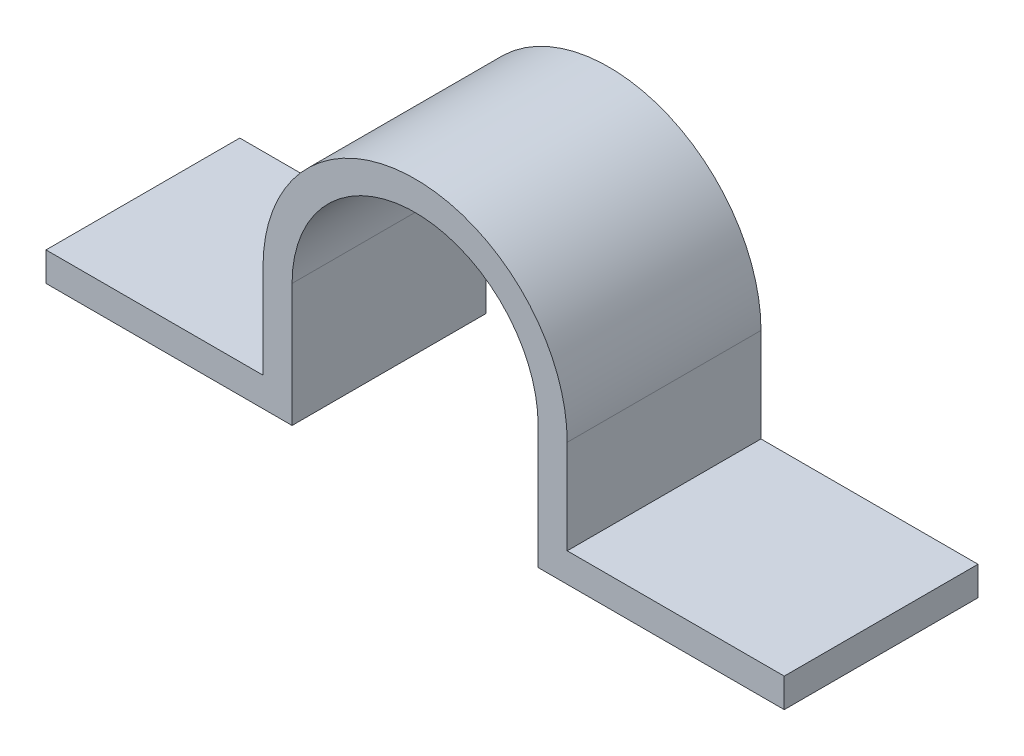
ISO-10303-21;
HEADER;
FILE_DESCRIPTION(('STEP AP214'),'2;1');
FILE_NAME('part.step','',(''),(''),'','','');
FILE_SCHEMA(('AUTOMOTIVE_DESIGN { 1 0 10303 214 1 1 1 1 }'));
ENDSEC;
DATA;
#1=APPLICATION_CONTEXT('core data for automotive mechanical design processes');
#2=APPLICATION_PROTOCOL_DEFINITION('international standard','automotive_design',2000,#1);
#3=PRODUCT_CONTEXT('',#1,'mechanical');
#4=PRODUCT('Part','Part','',(#3));
#5=PRODUCT_RELATED_PRODUCT_CATEGORY('part','',(#4));
#6=PRODUCT_DEFINITION_FORMATION('','',#4);
#7=PRODUCT_DEFINITION_CONTEXT('part definition',#1,'design');
#8=PRODUCT_DEFINITION('design','',#6,#7);
#9=PRODUCT_DEFINITION_SHAPE('','',#8);
#10=(LENGTH_UNIT() NAMED_UNIT(*) SI_UNIT(.MILLI.,.METRE.));
#11=(NAMED_UNIT(*) PLANE_ANGLE_UNIT() SI_UNIT($,.RADIAN.));
#12=(NAMED_UNIT(*) SI_UNIT($,.STERADIAN.) SOLID_ANGLE_UNIT());
#13=UNCERTAINTY_MEASURE_WITH_UNIT(LENGTH_MEASURE(1.E-05),#10,'distance_accuracy_value','');
#14=(GEOMETRIC_REPRESENTATION_CONTEXT(3) GLOBAL_UNCERTAINTY_ASSIGNED_CONTEXT((#13)) GLOBAL_UNIT_ASSIGNED_CONTEXT((#10,
#11,#12)) REPRESENTATION_CONTEXT('',''));
#15=CARTESIAN_POINT('',(0.,0.,0.));
#16=DIRECTION('',(0.,0.,1.));
#17=DIRECTION('',(1.,0.,0.));
#18=AXIS2_PLACEMENT_3D('',#15,#16,#17);
#19=CARTESIAN_POINT('',(-38.1,3.,20.));
#20=DIRECTION('',(0.,-1.,0.));
#21=DIRECTION('',(1.,0.,0.));
#22=AXIS2_PLACEMENT_3D('',#19,#20,#21);
#23=PLANE('',#22);
#24=DIRECTION('',(-1.,0.,0.));
#25=VECTOR('',#24,1.);
#26=CARTESIAN_POINT('',(-38.1,3.,0.));
#27=LINE('',#26,#25);
#28=CARTESIAN_POINT('',(-15.7,3.,0.));
#29=VERTEX_POINT('',#28);
#30=CARTESIAN_POINT('',(-38.1,3.,0.));
#31=VERTEX_POINT('',#30);
#32=EDGE_CURVE('E153',#29,#31,#27,.T.);
#33=ORIENTED_EDGE('',*,*,#32,.T.);
#34=DIRECTION('',(0.,0.,-1.));
#35=VECTOR('',#34,1.);
#36=CARTESIAN_POINT('',(-38.1,3.,20.));
#37=LINE('',#36,#35);
#38=CARTESIAN_POINT('',(-38.1,3.,20.));
#39=VERTEX_POINT('',#38);
#40=EDGE_CURVE('E11',#39,#31,#37,.T.);
#41=ORIENTED_EDGE('',*,*,#40,.F.);
#42=DIRECTION('',(-1.,0.,0.));
#43=VECTOR('',#42,1.);
#44=CARTESIAN_POINT('',(-38.1,3.,20.));
#45=LINE('',#44,#43);
#46=CARTESIAN_POINT('',(-15.7,3.,20.));
#47=VERTEX_POINT('',#46);
#48=EDGE_CURVE('E101',#47,#39,#45,.T.);
#49=ORIENTED_EDGE('',*,*,#48,.F.);
#50=DIRECTION('',(0.,0.,-1.));
#51=VECTOR('',#50,1.);
#52=CARTESIAN_POINT('',(-15.7,3.,20.));
#53=LINE('',#52,#51);
#54=EDGE_CURVE('E149',#47,#29,#53,.T.);
#55=ORIENTED_EDGE('',*,*,#54,.T.);
#56=EDGE_LOOP('',(#33,#41,#49,#55));
#57=FACE_BOUND('',#56,.T.);
#58=ADVANCED_FACE('F33',(#57),#23,.F.);
#59=CARTESIAN_POINT('',(-38.1,0.,20.));
#60=DIRECTION('',(-1.,0.,0.));
#61=DIRECTION('',(0.,0.,1.));
#62=AXIS2_PLACEMENT_3D('',#59,#60,#61);
#63=PLANE('',#62);
#64=DIRECTION('',(0.,1.,0.));
#65=VECTOR('',#64,1.);
#66=CARTESIAN_POINT('',(-38.1,0.,0.));
#67=LINE('',#66,#65);
#68=CARTESIAN_POINT('',(-38.1,0.,0.));
#69=VERTEX_POINT('',#68);
#70=EDGE_CURVE('E156',#69,#31,#67,.T.);
#71=ORIENTED_EDGE('',*,*,#70,.F.);
#72=DIRECTION('',(0.,0.,-1.));
#73=VECTOR('',#72,1.);
#74=CARTESIAN_POINT('',(-38.1,0.,20.));
#75=LINE('',#74,#73);
#76=CARTESIAN_POINT('',(-38.1,0.,20.));
#77=VERTEX_POINT('',#76);
#78=EDGE_CURVE('E41',#77,#69,#75,.T.);
#79=ORIENTED_EDGE('',*,*,#78,.F.);
#80=DIRECTION('',(0.,1.,0.));
#81=VECTOR('',#80,1.);
#82=CARTESIAN_POINT('',(-38.1,0.,20.));
#83=LINE('',#82,#81);
#84=EDGE_CURVE('E218',#77,#39,#83,.T.);
#85=ORIENTED_EDGE('',*,*,#84,.T.);
#86=ORIENTED_EDGE('',*,*,#40,.T.);
#87=EDGE_LOOP('',(#71,#79,#85,#86));
#88=FACE_BOUND('',#87,.T.);
#89=ADVANCED_FACE('F205',(#88),#63,.T.);
#90=CARTESIAN_POINT('',(-38.1,0.,20.));
#91=DIRECTION('',(0.,-1.,0.));
#92=DIRECTION('',(1.,0.,0.));
#93=AXIS2_PLACEMENT_3D('',#90,#91,#92);
#94=PLANE('',#93);
#95=DIRECTION('',(-1.,0.,0.));
#96=VECTOR('',#95,1.);
#97=CARTESIAN_POINT('',(-38.1,0.,0.));
#98=LINE('',#97,#96);
#99=CARTESIAN_POINT('',(-12.7,0.,0.));
#100=VERTEX_POINT('',#99);
#101=EDGE_CURVE('E159',#100,#69,#98,.T.);
#102=ORIENTED_EDGE('',*,*,#101,.F.);
#103=DIRECTION('',(0.,0.,-1.));
#104=VECTOR('',#103,1.);
#105=CARTESIAN_POINT('',(-12.7,0.,20.));
#106=LINE('',#105,#104);
#107=CARTESIAN_POINT('',(-12.7,0.,20.));
#108=VERTEX_POINT('',#107);
#109=EDGE_CURVE('E195',#108,#100,#106,.T.);
#110=ORIENTED_EDGE('',*,*,#109,.F.);
#111=DIRECTION('',(-1.,0.,0.));
#112=VECTOR('',#111,1.);
#113=CARTESIAN_POINT('',(-38.1,0.,20.));
#114=LINE('',#113,#112);
#115=EDGE_CURVE('E202',#108,#77,#114,.T.);
#116=ORIENTED_EDGE('',*,*,#115,.T.);
#117=ORIENTED_EDGE('',*,*,#78,.T.);
#118=EDGE_LOOP('',(#102,#110,#116,#117));
#119=FACE_BOUND('',#118,.T.);
#120=ADVANCED_FACE('F200',(#119),#94,.T.);
#121=CARTESIAN_POINT('',(-12.7,0.,20.));
#122=DIRECTION('',(1.,0.,0.));
#123=DIRECTION('',(0.,0.,-1.));
#124=AXIS2_PLACEMENT_3D('',#121,#122,#123);
#125=PLANE('',#124);
#126=DIRECTION('',(0.,-1.,0.));
#127=VECTOR('',#126,1.);
#128=CARTESIAN_POINT('',(-12.7,0.,0.));
#129=LINE('',#128,#127);
#130=CARTESIAN_POINT('',(-12.7,12.7,0.));
#131=VERTEX_POINT('',#130);
#132=EDGE_CURVE('E162',#131,#100,#129,.T.);
#133=ORIENTED_EDGE('',*,*,#132,.F.);
#134=DIRECTION('',(0.,0.,-1.));
#135=VECTOR('',#134,1.);
#136=CARTESIAN_POINT('',(-12.7,12.7,20.));
#137=LINE('',#136,#135);
#138=CARTESIAN_POINT('',(-12.7,12.7,20.));
#139=VERTEX_POINT('',#138);
#140=EDGE_CURVE('E193',#139,#131,#137,.T.);
#141=ORIENTED_EDGE('',*,*,#140,.F.);
#142=DIRECTION('',(0.,-1.,0.));
#143=VECTOR('',#142,1.);
#144=CARTESIAN_POINT('',(-12.7,0.,20.));
#145=LINE('',#144,#143);
#146=EDGE_CURVE('E215',#139,#108,#145,.T.);
#147=ORIENTED_EDGE('',*,*,#146,.T.);
#148=ORIENTED_EDGE('',*,*,#109,.T.);
#149=EDGE_LOOP('',(#133,#141,#147,#148));
#150=FACE_BOUND('',#149,.T.);
#151=ADVANCED_FACE('F212',(#150),#125,.T.);
#152=CARTESIAN_POINT('',(0.,12.7,20.));
#153=DIRECTION('',(0.,0.,-1.));
#154=DIRECTION('',(-1.,0.,0.));
#155=AXIS2_PLACEMENT_3D('',#152,#153,#154);
#156=CYLINDRICAL_SURFACE('',#155,12.7);
#157=CARTESIAN_POINT('',(0.,12.7,0.));
#158=DIRECTION('',(0.,0.,1.));
#159=DIRECTION('',(-1.,0.,0.));
#160=AXIS2_PLACEMENT_3D('',#157,#158,#159);
#161=CIRCLE('',#160,12.7);
#162=CARTESIAN_POINT('',(12.7,12.7,0.));
#163=VERTEX_POINT('',#162);
#164=EDGE_CURVE('E165',#163,#131,#161,.T.);
#165=ORIENTED_EDGE('',*,*,#164,.F.);
#166=DIRECTION('',(0.,0.,-1.));
#167=VECTOR('',#166,1.);
#168=CARTESIAN_POINT('',(12.7,12.7,20.));
#169=LINE('',#168,#167);
#170=CARTESIAN_POINT('',(12.7,12.7,20.));
#171=VERTEX_POINT('',#170);
#172=EDGE_CURVE('E191',#171,#163,#169,.T.);
#173=ORIENTED_EDGE('',*,*,#172,.F.);
#174=CARTESIAN_POINT('',(0.,12.7,20.));
#175=DIRECTION('',(0.,0.,1.));
#176=DIRECTION('',(-1.,0.,0.));
#177=AXIS2_PLACEMENT_3D('',#174,#175,#176);
#178=CIRCLE('',#177,12.7);
#179=EDGE_CURVE('E220',#171,#139,#178,.T.);
#180=ORIENTED_EDGE('',*,*,#179,.T.);
#181=ORIENTED_EDGE('',*,*,#140,.T.);
#182=EDGE_LOOP('',(#165,#173,#180,#181));
#183=FACE_BOUND('',#182,.T.);
#184=ADVANCED_FACE('F320',(#183),#156,.F.);
#185=CARTESIAN_POINT('',(12.7,0.,20.));
#186=DIRECTION('',(-1.,0.,0.));
#187=DIRECTION('',(0.,0.,1.));
#188=AXIS2_PLACEMENT_3D('',#185,#186,#187);
#189=PLANE('',#188);
#190=DIRECTION('',(0.,1.,0.));
#191=VECTOR('',#190,1.);
#192=CARTESIAN_POINT('',(12.7,0.,0.));
#193=LINE('',#192,#191);
#194=CARTESIAN_POINT('',(12.7,0.,0.));
#195=VERTEX_POINT('',#194);
#196=EDGE_CURVE('E168',#195,#163,#193,.T.);
#197=ORIENTED_EDGE('',*,*,#196,.F.);
#198=DIRECTION('',(0.,0.,-1.));
#199=VECTOR('',#198,1.);
#200=CARTESIAN_POINT('',(12.7,0.,20.));
#201=LINE('',#200,#199);
#202=CARTESIAN_POINT('',(12.7,0.,20.));
#203=VERTEX_POINT('',#202);
#204=EDGE_CURVE('E189',#203,#195,#201,.T.);
#205=ORIENTED_EDGE('',*,*,#204,.F.);
#206=DIRECTION('',(0.,1.,0.));
#207=VECTOR('',#206,1.);
#208=CARTESIAN_POINT('',(12.7,0.,20.));
#209=LINE('',#208,#207);
#210=EDGE_CURVE('E226',#203,#171,#209,.T.);
#211=ORIENTED_EDGE('',*,*,#210,.T.);
#212=ORIENTED_EDGE('',*,*,#172,.T.);
#213=EDGE_LOOP('',(#197,#205,#211,#212));
#214=FACE_BOUND('',#213,.T.);
#215=ADVANCED_FACE('F311',(#214),#189,.T.);
#216=CARTESIAN_POINT('',(38.1,0.,20.));
#217=DIRECTION('',(0.,-1.,0.));
#218=DIRECTION('',(1.,0.,0.));
#219=AXIS2_PLACEMENT_3D('',#216,#217,#218);
#220=PLANE('',#219);
#221=DIRECTION('',(-1.,0.,0.));
#222=VECTOR('',#221,1.);
#223=CARTESIAN_POINT('',(38.1,0.,0.));
#224=LINE('',#223,#222);
#225=CARTESIAN_POINT('',(38.1,0.,0.));
#226=VERTEX_POINT('',#225);
#227=EDGE_CURVE('E171',#226,#195,#224,.T.);
#228=ORIENTED_EDGE('',*,*,#227,.F.);
#229=DIRECTION('',(0.,0.,-1.));
#230=VECTOR('',#229,1.);
#231=CARTESIAN_POINT('',(38.1,0.,20.));
#232=LINE('',#231,#230);
#233=CARTESIAN_POINT('',(38.1,0.,20.));
#234=VERTEX_POINT('',#233);
#235=EDGE_CURVE('E187',#234,#226,#232,.T.);
#236=ORIENTED_EDGE('',*,*,#235,.F.);
#237=DIRECTION('',(-1.,0.,0.));
#238=VECTOR('',#237,1.);
#239=CARTESIAN_POINT('',(38.1,0.,20.));
#240=LINE('',#239,#238);
#241=EDGE_CURVE('E229',#234,#203,#240,.T.);
#242=ORIENTED_EDGE('',*,*,#241,.T.);
#243=ORIENTED_EDGE('',*,*,#204,.T.);
#244=EDGE_LOOP('',(#228,#236,#242,#243));
#245=FACE_BOUND('',#244,.T.);
#246=ADVANCED_FACE('F241',(#245),#220,.T.);
#247=CARTESIAN_POINT('',(38.1,3.,20.));
#248=DIRECTION('',(1.,0.,0.));
#249=DIRECTION('',(0.,0.,-1.));
#250=AXIS2_PLACEMENT_3D('',#247,#248,#249);
#251=PLANE('',#250);
#252=DIRECTION('',(0.,-1.,0.));
#253=VECTOR('',#252,1.);
#254=CARTESIAN_POINT('',(38.1,3.,0.));
#255=LINE('',#254,#253);
#256=CARTESIAN_POINT('',(38.1,3.,0.));
#257=VERTEX_POINT('',#256);
#258=EDGE_CURVE('E174',#257,#226,#255,.T.);
#259=ORIENTED_EDGE('',*,*,#258,.F.);
#260=DIRECTION('',(0.,0.,-1.));
#261=VECTOR('',#260,1.);
#262=CARTESIAN_POINT('',(38.1,3.,20.));
#263=LINE('',#262,#261);
#264=CARTESIAN_POINT('',(38.1,3.,20.));
#265=VERTEX_POINT('',#264);
#266=EDGE_CURVE('E185',#265,#257,#263,.T.);
#267=ORIENTED_EDGE('',*,*,#266,.F.);
#268=DIRECTION('',(0.,-1.,0.));
#269=VECTOR('',#268,1.);
#270=CARTESIAN_POINT('',(38.1,3.,20.));
#271=LINE('',#270,#269);
#272=EDGE_CURVE('E232',#265,#234,#271,.T.);
#273=ORIENTED_EDGE('',*,*,#272,.T.);
#274=ORIENTED_EDGE('',*,*,#235,.T.);
#275=EDGE_LOOP('',(#259,#267,#273,#274));
#276=FACE_BOUND('',#275,.T.);
#277=ADVANCED_FACE('F236',(#276),#251,.T.);
#278=CARTESIAN_POINT('',(38.1,3.,20.));
#279=DIRECTION('',(0.,-1.,0.));
#280=DIRECTION('',(1.,0.,0.));
#281=AXIS2_PLACEMENT_3D('',#278,#279,#280);
#282=PLANE('',#281);
#283=DIRECTION('',(-1.,0.,0.));
#284=VECTOR('',#283,1.);
#285=CARTESIAN_POINT('',(38.1,3.,0.));
#286=LINE('',#285,#284);
#287=CARTESIAN_POINT('',(15.7,3.,0.));
#288=VERTEX_POINT('',#287);
#289=EDGE_CURVE('E177',#257,#288,#286,.T.);
#290=ORIENTED_EDGE('',*,*,#289,.T.);
#291=DIRECTION('',(0.,0.,-1.));
#292=VECTOR('',#291,1.);
#293=CARTESIAN_POINT('',(15.7,3.,20.));
#294=LINE('',#293,#292);
#295=CARTESIAN_POINT('',(15.7,3.,20.));
#296=VERTEX_POINT('',#295);
#297=EDGE_CURVE('E144',#296,#288,#294,.T.);
#298=ORIENTED_EDGE('',*,*,#297,.F.);
#299=DIRECTION('',(-1.,0.,0.));
#300=VECTOR('',#299,1.);
#301=CARTESIAN_POINT('',(38.1,3.,20.));
#302=LINE('',#301,#300);
#303=EDGE_CURVE('E135',#265,#296,#302,.T.);
#304=ORIENTED_EDGE('',*,*,#303,.F.);
#305=ORIENTED_EDGE('',*,*,#266,.T.);
#306=EDGE_LOOP('',(#290,#298,#304,#305));
#307=FACE_BOUND('',#306,.T.);
#308=ADVANCED_FACE('F245',(#307),#282,.F.);
#309=CARTESIAN_POINT('',(15.7,0.,20.));
#310=DIRECTION('',(-1.,0.,0.));
#311=DIRECTION('',(0.,0.,1.));
#312=AXIS2_PLACEMENT_3D('',#309,#310,#311);
#313=PLANE('',#312);
#314=DIRECTION('',(0.,1.,0.));
#315=VECTOR('',#314,1.);
#316=CARTESIAN_POINT('',(15.7,0.,0.));
#317=LINE('',#316,#315);
#318=CARTESIAN_POINT('',(15.7,12.7,0.));
#319=VERTEX_POINT('',#318);
#320=EDGE_CURVE('E143',#288,#319,#317,.T.);
#321=ORIENTED_EDGE('',*,*,#320,.T.);
#322=DIRECTION('',(0.,0.,-1.));
#323=VECTOR('',#322,1.);
#324=CARTESIAN_POINT('',(15.7,12.7,20.));
#325=LINE('',#324,#323);
#326=CARTESIAN_POINT('',(15.7,12.7,20.));
#327=VERTEX_POINT('',#326);
#328=EDGE_CURVE('E140',#327,#319,#325,.T.);
#329=ORIENTED_EDGE('',*,*,#328,.F.);
#330=DIRECTION('',(0.,1.,0.));
#331=VECTOR('',#330,1.);
#332=CARTESIAN_POINT('',(15.7,0.,20.));
#333=LINE('',#332,#331);
#334=EDGE_CURVE('E128',#296,#327,#333,.T.);
#335=ORIENTED_EDGE('',*,*,#334,.F.);
#336=ORIENTED_EDGE('',*,*,#297,.T.);
#337=EDGE_LOOP('',(#321,#329,#335,#336));
#338=FACE_BOUND('',#337,.T.);
#339=ADVANCED_FACE('F141',(#338),#313,.F.);
#340=CARTESIAN_POINT('',(0.,12.7,20.));
#341=DIRECTION('',(0.,0.,-1.));
#342=DIRECTION('',(-1.,0.,0.));
#343=AXIS2_PLACEMENT_3D('',#340,#341,#342);
#344=CYLINDRICAL_SURFACE('',#343,15.7);
#345=CARTESIAN_POINT('',(0.,12.7,0.));
#346=DIRECTION('',(0.,0.,1.));
#347=DIRECTION('',(1.,0.,0.));
#348=AXIS2_PLACEMENT_3D('',#345,#346,#347);
#349=CIRCLE('',#348,15.7);
#350=CARTESIAN_POINT('',(-15.7,12.7,0.));
#351=VERTEX_POINT('',#350);
#352=EDGE_CURVE('E89',#319,#351,#349,.T.);
#353=ORIENTED_EDGE('',*,*,#352,.T.);
#354=DIRECTION('',(0.,0.,-1.));
#355=VECTOR('',#354,1.);
#356=CARTESIAN_POINT('',(-15.7,12.7,20.));
#357=LINE('',#356,#355);
#358=CARTESIAN_POINT('',(-15.7,12.7,20.));
#359=VERTEX_POINT('',#358);
#360=EDGE_CURVE('E145',#359,#351,#357,.T.);
#361=ORIENTED_EDGE('',*,*,#360,.F.);
#362=CARTESIAN_POINT('',(0.,12.7,20.));
#363=DIRECTION('',(0.,0.,1.));
#364=DIRECTION('',(1.,0.,0.));
#365=AXIS2_PLACEMENT_3D('',#362,#363,#364);
#366=CIRCLE('',#365,15.7);
#367=EDGE_CURVE('E132',#327,#359,#366,.T.);
#368=ORIENTED_EDGE('',*,*,#367,.F.);
#369=ORIENTED_EDGE('',*,*,#328,.T.);
#370=EDGE_LOOP('',(#353,#361,#368,#369));
#371=FACE_BOUND('',#370,.T.);
#372=ADVANCED_FACE('F147',(#371),#344,.T.);
#373=CARTESIAN_POINT('',(-15.7,0.,20.));
#374=DIRECTION('',(1.,0.,0.));
#375=DIRECTION('',(0.,0.,-1.));
#376=AXIS2_PLACEMENT_3D('',#373,#374,#375);
#377=PLANE('',#376);
#378=DIRECTION('',(0.,1.,0.));
#379=VECTOR('',#378,1.);
#380=CARTESIAN_POINT('',(-15.7,0.,0.));
#381=LINE('',#380,#379);
#382=EDGE_CURVE('E95',#351,#29,#381,.F.);
#383=ORIENTED_EDGE('',*,*,#382,.T.);
#384=ORIENTED_EDGE('',*,*,#54,.F.);
#385=DIRECTION('',(0.,1.,0.));
#386=VECTOR('',#385,1.);
#387=CARTESIAN_POINT('',(-15.7,0.,20.));
#388=LINE('',#387,#386);
#389=EDGE_CURVE('E49',#359,#47,#388,.F.);
#390=ORIENTED_EDGE('',*,*,#389,.F.);
#391=ORIENTED_EDGE('',*,*,#360,.T.);
#392=EDGE_LOOP('',(#383,#384,#390,#391));
#393=FACE_BOUND('',#392,.T.);
#394=ADVANCED_FACE('F259',(#393),#377,.F.);
#395=CARTESIAN_POINT('',(0.,12.7,20.));
#396=DIRECTION('',(0.,0.,1.));
#397=DIRECTION('',(1.,0.,0.));
#398=AXIS2_PLACEMENT_3D('',#395,#396,#397);
#399=PLANE('',#398);
#400=ORIENTED_EDGE('',*,*,#48,.T.);
#401=ORIENTED_EDGE('',*,*,#84,.F.);
#402=ORIENTED_EDGE('',*,*,#115,.F.);
#403=ORIENTED_EDGE('',*,*,#146,.F.);
#404=ORIENTED_EDGE('',*,*,#179,.F.);
#405=ORIENTED_EDGE('',*,*,#210,.F.);
#406=ORIENTED_EDGE('',*,*,#241,.F.);
#407=ORIENTED_EDGE('',*,*,#272,.F.);
#408=ORIENTED_EDGE('',*,*,#303,.T.);
#409=ORIENTED_EDGE('',*,*,#334,.T.);
#410=ORIENTED_EDGE('',*,*,#367,.T.);
#411=ORIENTED_EDGE('',*,*,#389,.T.);
#412=EDGE_LOOP('',(#400,#401,#402,#403,#404,#405,#406,#407,#408,#409,#410,#411));
#413=FACE_BOUND('',#412,.T.);
#414=ADVANCED_FACE('F130',(#413),#399,.T.);
#415=CARTESIAN_POINT('',(0.,12.7,0.));
#416=DIRECTION('',(0.,0.,1.));
#417=DIRECTION('',(1.,0.,0.));
#418=AXIS2_PLACEMENT_3D('',#415,#416,#417);
#419=PLANE('',#418);
#420=ORIENTED_EDGE('',*,*,#32,.F.);
#421=ORIENTED_EDGE('',*,*,#382,.F.);
#422=ORIENTED_EDGE('',*,*,#352,.F.);
#423=ORIENTED_EDGE('',*,*,#320,.F.);
#424=ORIENTED_EDGE('',*,*,#289,.F.);
#425=ORIENTED_EDGE('',*,*,#258,.T.);
#426=ORIENTED_EDGE('',*,*,#227,.T.);
#427=ORIENTED_EDGE('',*,*,#196,.T.);
#428=ORIENTED_EDGE('',*,*,#164,.T.);
#429=ORIENTED_EDGE('',*,*,#132,.T.);
#430=ORIENTED_EDGE('',*,*,#101,.T.);
#431=ORIENTED_EDGE('',*,*,#70,.T.);
#432=EDGE_LOOP('',(#420,#421,#422,#423,#424,#425,#426,#427,#428,#429,#430,#431));
#433=FACE_BOUND('',#432,.T.);
#434=ADVANCED_FACE('F208',(#433),#419,.F.);
#435=CLOSED_SHELL('',(#58,#89,#120,#151,#184,#215,#246,#277,#308,#339,#372,#394,#414,#434));
#436=MANIFOLD_SOLID_BREP('B2',#435);
#437=ADVANCED_BREP_SHAPE_REPRESENTATION('',(#18,#436),#14);
#438=SHAPE_DEFINITION_REPRESENTATION(#9,#437);
ENDSEC;
END-ISO-10303-21;
